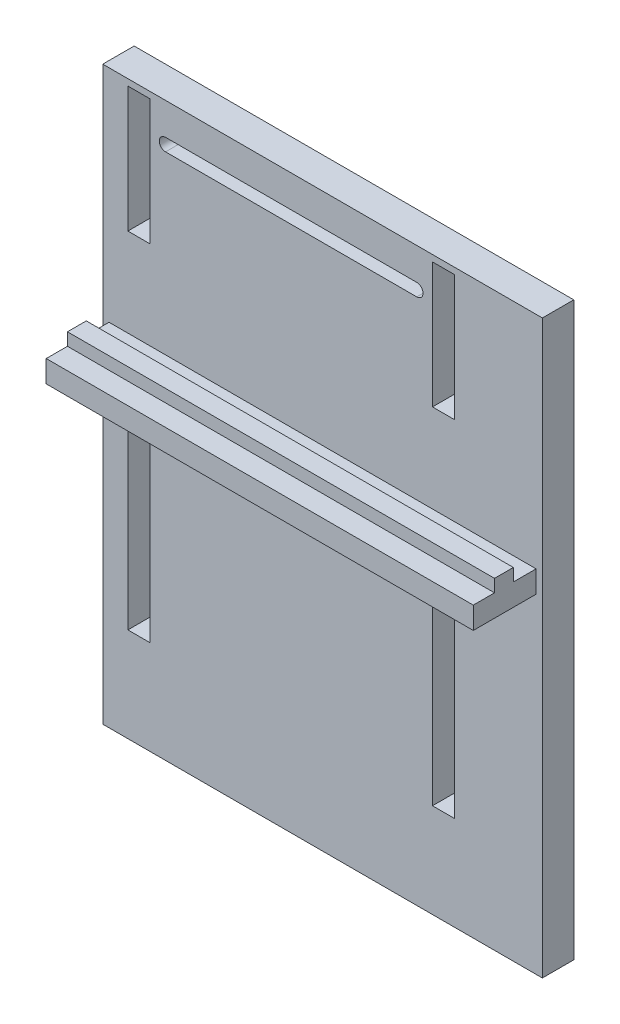
ISO-10303-21;
HEADER;
FILE_DESCRIPTION(('STEP AP214'),'2;1');
FILE_NAME('part.step','',(''),(''),'','','');
FILE_SCHEMA(('AUTOMOTIVE_DESIGN { 1 0 10303 214 1 1 1 1 }'));
ENDSEC;
DATA;
#1=APPLICATION_CONTEXT('core data for automotive mechanical design processes');
#2=APPLICATION_PROTOCOL_DEFINITION('international standard','automotive_design',2000,#1);
#3=PRODUCT_CONTEXT('',#1,'mechanical');
#4=PRODUCT('Part','Part','',(#3));
#5=PRODUCT_RELATED_PRODUCT_CATEGORY('part','',(#4));
#6=PRODUCT_DEFINITION_FORMATION('','',#4);
#7=PRODUCT_DEFINITION_CONTEXT('part definition',#1,'design');
#8=PRODUCT_DEFINITION('design','',#6,#7);
#9=PRODUCT_DEFINITION_SHAPE('','',#8);
#10=(LENGTH_UNIT() NAMED_UNIT(*) SI_UNIT(.MILLI.,.METRE.));
#11=(NAMED_UNIT(*) PLANE_ANGLE_UNIT() SI_UNIT($,.RADIAN.));
#12=(NAMED_UNIT(*) SI_UNIT($,.STERADIAN.) SOLID_ANGLE_UNIT());
#13=UNCERTAINTY_MEASURE_WITH_UNIT(LENGTH_MEASURE(1.E-05),#10,'distance_accuracy_value','');
#14=(GEOMETRIC_REPRESENTATION_CONTEXT(3) GLOBAL_UNCERTAINTY_ASSIGNED_CONTEXT((#13)) GLOBAL_UNIT_ASSIGNED_CONTEXT((#10,
#11,#12)) REPRESENTATION_CONTEXT('',''));
#15=CARTESIAN_POINT('',(0.,0.,0.));
#16=DIRECTION('',(0.,0.,1.));
#17=DIRECTION('',(1.,0.,0.));
#18=AXIS2_PLACEMENT_3D('',#15,#16,#17);
#19=CARTESIAN_POINT('',(0.,0.,5.));
#20=DIRECTION('',(0.,0.,-1.));
#21=DIRECTION('',(-1.,0.,0.));
#22=AXIS2_PLACEMENT_3D('',#19,#20,#21);
#23=PLANE('',#22);
#24=DIRECTION('',(0.,1.,0.));
#25=VECTOR('',#24,1.);
#26=CARTESIAN_POINT('',(26.,40.,5.));
#27=LINE('',#26,#25);
#28=CARTESIAN_POINT('',(26.,20.,5.));
#29=VERTEX_POINT('',#28);
#30=CARTESIAN_POINT('',(26.,40.,5.));
#31=VERTEX_POINT('',#30);
#32=EDGE_CURVE('E381',#29,#31,#27,.T.);
#33=ORIENTED_EDGE('',*,*,#32,.F.);
#34=DIRECTION('',(1.,0.,0.));
#35=VECTOR('',#34,1.);
#36=CARTESIAN_POINT('',(26.,20.,5.));
#37=LINE('',#36,#35);
#38=CARTESIAN_POINT('',(22.5,20.,5.));
#39=VERTEX_POINT('',#38);
#40=EDGE_CURVE('E389',#39,#29,#37,.T.);
#41=ORIENTED_EDGE('',*,*,#40,.F.);
#42=DIRECTION('',(0.,-1.,0.));
#43=VECTOR('',#42,1.);
#44=CARTESIAN_POINT('',(22.5,40.,5.));
#45=LINE('',#44,#43);
#46=CARTESIAN_POINT('',(22.5,40.,5.));
#47=VERTEX_POINT('',#46);
#48=EDGE_CURVE('E386',#47,#39,#45,.T.);
#49=ORIENTED_EDGE('',*,*,#48,.F.);
#50=DIRECTION('',(-1.,0.,0.));
#51=VECTOR('',#50,1.);
#52=CARTESIAN_POINT('',(26.,40.,5.));
#53=LINE('',#52,#51);
#54=EDGE_CURVE('E383',#31,#47,#53,.T.);
#55=ORIENTED_EDGE('',*,*,#54,.F.);
#56=EDGE_LOOP('',(#33,#41,#49,#55));
#57=FACE_BOUND('',#56,.T.);
#58=DIRECTION('',(0.,-1.,0.));
#59=VECTOR('',#58,1.);
#60=CARTESIAN_POINT('',(22.5,-5.,5.));
#61=LINE('',#60,#59);
#62=CARTESIAN_POINT('',(22.5,-5.,5.));
#63=VERTEX_POINT('',#62);
#64=CARTESIAN_POINT('',(22.5,-35.,5.));
#65=VERTEX_POINT('',#64);
#66=EDGE_CURVE('E443',#63,#65,#61,.T.);
#67=ORIENTED_EDGE('',*,*,#66,.F.);
#68=DIRECTION('',(-1.,0.,0.));
#69=VECTOR('',#68,1.);
#70=CARTESIAN_POINT('',(26.,-5.,5.));
#71=LINE('',#70,#69);
#72=CARTESIAN_POINT('',(26.,-5.,5.));
#73=VERTEX_POINT('',#72);
#74=EDGE_CURVE('E451',#73,#63,#71,.T.);
#75=ORIENTED_EDGE('',*,*,#74,.F.);
#76=DIRECTION('',(0.,1.,0.));
#77=VECTOR('',#76,1.);
#78=CARTESIAN_POINT('',(26.,-5.,5.));
#79=LINE('',#78,#77);
#80=CARTESIAN_POINT('',(26.,-35.,5.));
#81=VERTEX_POINT('',#80);
#82=EDGE_CURVE('E448',#81,#73,#79,.T.);
#83=ORIENTED_EDGE('',*,*,#82,.F.);
#84=DIRECTION('',(1.,0.,0.));
#85=VECTOR('',#84,1.);
#86=CARTESIAN_POINT('',(26.,-35.,5.));
#87=LINE('',#86,#85);
#88=EDGE_CURVE('E445',#65,#81,#87,.T.);
#89=ORIENTED_EDGE('',*,*,#88,.F.);
#90=EDGE_LOOP('',(#67,#75,#83,#89));
#91=FACE_BOUND('',#90,.T.);
#92=DIRECTION('',(0.,-1.,0.));
#93=VECTOR('',#92,1.);
#94=CARTESIAN_POINT('',(40.,50.,5.));
#95=LINE('',#94,#93);
#96=CARTESIAN_POINT('',(40.,41.0197048078766,5.));
#97=VERTEX_POINT('',#96);
#98=CARTESIAN_POINT('',(40.,-50.,5.));
#99=VERTEX_POINT('',#98);
#100=EDGE_CURVE('E254',#97,#99,#95,.T.);
#101=ORIENTED_EDGE('',*,*,#100,.F.);
#102=DIRECTION('',(1.,0.,0.));
#103=VECTOR('',#102,1.);
#104=CARTESIAN_POINT('',(40.,41.0197048078766,5.));
#105=LINE('',#104,#103);
#106=CARTESIAN_POINT('',(-30.,41.0197048078766,5.));
#107=VERTEX_POINT('',#106);
#108=EDGE_CURVE('E47',#107,#97,#105,.T.);
#109=ORIENTED_EDGE('',*,*,#108,.F.);
#110=DIRECTION('',(0.,-1.,0.));
#111=VECTOR('',#110,1.);
#112=CARTESIAN_POINT('',(-30.,50.,5.));
#113=LINE('',#112,#111);
#114=CARTESIAN_POINT('',(-30.,-50.,5.));
#115=VERTEX_POINT('',#114);
#116=EDGE_CURVE('E252',#107,#115,#113,.T.);
#117=ORIENTED_EDGE('',*,*,#116,.T.);
#118=DIRECTION('',(1.,0.,0.));
#119=VECTOR('',#118,1.);
#120=CARTESIAN_POINT('',(30.,-50.,5.));
#121=LINE('',#120,#119);
#122=EDGE_CURVE('E259',#115,#99,#121,.T.);
#123=ORIENTED_EDGE('',*,*,#122,.T.);
#124=EDGE_LOOP('',(#101,#109,#117,#123));
#125=FACE_BOUND('',#124,.T.);
#126=DIRECTION('',(0.,-1.,0.));
#127=VECTOR('',#126,1.);
#128=CARTESIAN_POINT('',(-26.,-5.00000000000001,5.));
#129=LINE('',#128,#127);
#130=CARTESIAN_POINT('',(-26.,-5.00000000000001,5.));
#131=VERTEX_POINT('',#130);
#132=CARTESIAN_POINT('',(-26.,-35.,5.));
#133=VERTEX_POINT('',#132);
#134=EDGE_CURVE('E412',#131,#133,#129,.T.);
#135=ORIENTED_EDGE('',*,*,#134,.F.);
#136=DIRECTION('',(-1.,0.,0.));
#137=VECTOR('',#136,1.);
#138=CARTESIAN_POINT('',(-26.,-5.00000000000001,5.));
#139=LINE('',#138,#137);
#140=CARTESIAN_POINT('',(-22.5,-5.00000000000001,5.));
#141=VERTEX_POINT('',#140);
#142=EDGE_CURVE('E420',#141,#131,#139,.T.);
#143=ORIENTED_EDGE('',*,*,#142,.F.);
#144=DIRECTION('',(0.,1.,0.));
#145=VECTOR('',#144,1.);
#146=CARTESIAN_POINT('',(-22.5,-5.00000000000001,5.));
#147=LINE('',#146,#145);
#148=CARTESIAN_POINT('',(-22.5,-35.,5.));
#149=VERTEX_POINT('',#148);
#150=EDGE_CURVE('E417',#149,#141,#147,.T.);
#151=ORIENTED_EDGE('',*,*,#150,.F.);
#152=DIRECTION('',(1.,0.,0.));
#153=VECTOR('',#152,1.);
#154=CARTESIAN_POINT('',(-26.,-35.,5.));
#155=LINE('',#154,#153);
#156=EDGE_CURVE('E414',#133,#149,#155,.T.);
#157=ORIENTED_EDGE('',*,*,#156,.F.);
#158=EDGE_LOOP('',(#135,#143,#151,#157));
#159=FACE_BOUND('',#158,.T.);
#160=DIRECTION('',(0.,-1.,0.));
#161=VECTOR('',#160,1.);
#162=CARTESIAN_POINT('',(-26.,40.,5.));
#163=LINE('',#162,#161);
#164=CARTESIAN_POINT('',(-26.,40.,5.));
#165=VERTEX_POINT('',#164);
#166=CARTESIAN_POINT('',(-26.,20.,5.));
#167=VERTEX_POINT('',#166);
#168=EDGE_CURVE('E350',#165,#167,#163,.T.);
#169=ORIENTED_EDGE('',*,*,#168,.F.);
#170=DIRECTION('',(-1.,0.,0.));
#171=VECTOR('',#170,1.);
#172=CARTESIAN_POINT('',(-26.,40.,5.));
#173=LINE('',#172,#171);
#174=CARTESIAN_POINT('',(-22.5,40.,5.));
#175=VERTEX_POINT('',#174);
#176=EDGE_CURVE('E358',#175,#165,#173,.T.);
#177=ORIENTED_EDGE('',*,*,#176,.F.);
#178=DIRECTION('',(0.,1.,0.));
#179=VECTOR('',#178,1.);
#180=CARTESIAN_POINT('',(-22.5,40.,5.));
#181=LINE('',#180,#179);
#182=CARTESIAN_POINT('',(-22.5,20.,5.));
#183=VERTEX_POINT('',#182);
#184=EDGE_CURVE('E355',#183,#175,#181,.T.);
#185=ORIENTED_EDGE('',*,*,#184,.F.);
#186=DIRECTION('',(1.,0.,0.));
#187=VECTOR('',#186,1.);
#188=CARTESIAN_POINT('',(-26.,20.,5.));
#189=LINE('',#188,#187);
#190=EDGE_CURVE('E352',#167,#183,#189,.T.);
#191=ORIENTED_EDGE('',*,*,#190,.F.);
#192=EDGE_LOOP('',(#169,#177,#185,#191));
#193=FACE_BOUND('',#192,.T.);
#194=DIRECTION('',(1.,0.,0.));
#195=VECTOR('',#194,1.);
#196=CARTESIAN_POINT('',(-20.,33.9239769318222,5.));
#197=LINE('',#196,#195);
#198=CARTESIAN_POINT('',(-20.,33.9239769318222,5.));
#199=VERTEX_POINT('',#198);
#200=CARTESIAN_POINT('',(20.,33.9239769318222,5.));
#201=VERTEX_POINT('',#200);
#202=EDGE_CURVE('E551',#199,#201,#197,.T.);
#203=ORIENTED_EDGE('',*,*,#202,.F.);
#204=CARTESIAN_POINT('',(-20.,34.9239769318222,5.));
#205=DIRECTION('',(0.,0.,1.));
#206=DIRECTION('',(1.,0.,0.));
#207=AXIS2_PLACEMENT_3D('',#204,#205,#206);
#208=CIRCLE('',#207,1.);
#209=CARTESIAN_POINT('',(-20.,35.9239769318222,5.));
#210=VERTEX_POINT('',#209);
#211=EDGE_CURVE('E55',#210,#199,#208,.T.);
#212=ORIENTED_EDGE('',*,*,#211,.F.);
#213=DIRECTION('',(-1.,0.,0.));
#214=VECTOR('',#213,1.);
#215=CARTESIAN_POINT('',(-20.,35.9239769318222,5.));
#216=LINE('',#215,#214);
#217=CARTESIAN_POINT('',(20.,35.9239769318222,5.));
#218=VERTEX_POINT('',#217);
#219=EDGE_CURVE('E290',#218,#210,#216,.T.);
#220=ORIENTED_EDGE('',*,*,#219,.F.);
#221=CARTESIAN_POINT('',(20.,34.9239769318222,5.));
#222=DIRECTION('',(0.,0.,1.));
#223=DIRECTION('',(1.,0.,0.));
#224=AXIS2_PLACEMENT_3D('',#221,#222,#223);
#225=CIRCLE('',#224,1.);
#226=EDGE_CURVE('E303',#201,#218,#225,.T.);
#227=ORIENTED_EDGE('',*,*,#226,.F.);
#228=EDGE_LOOP('',(#203,#212,#220,#227));
#229=FACE_BOUND('',#228,.T.);
#230=DIRECTION('',(0.,1.,0.));
#231=VECTOR('',#230,1.);
#232=CARTESIAN_POINT('',(39.,2.42397693182216,5.));
#233=LINE('',#232,#231);
#234=CARTESIAN_POINT('',(39.,2.42397693182216,5.));
#235=VERTEX_POINT('',#234);
#236=CARTESIAN_POINT('',(39.,5.92397693182216,5.));
#237=VERTEX_POINT('',#236);
#238=EDGE_CURVE('E560',#235,#237,#233,.T.);
#239=ORIENTED_EDGE('',*,*,#238,.F.);
#240=DIRECTION('',(1.,0.,0.));
#241=VECTOR('',#240,1.);
#242=CARTESIAN_POINT('',(29.,2.42397693182216,5.));
#243=LINE('',#242,#241);
#244=CARTESIAN_POINT('',(-29.,2.42397693182216,5.));
#245=VERTEX_POINT('',#244);
#246=EDGE_CURVE('E332',#245,#235,#243,.T.);
#247=ORIENTED_EDGE('',*,*,#246,.F.);
#248=DIRECTION('',(0.,-1.,0.));
#249=VECTOR('',#248,1.);
#250=CARTESIAN_POINT('',(-29.,5.92397693182216,5.));
#251=LINE('',#250,#249);
#252=CARTESIAN_POINT('',(-29.,5.92397693182216,5.));
#253=VERTEX_POINT('',#252);
#254=EDGE_CURVE('E339',#253,#245,#251,.T.);
#255=ORIENTED_EDGE('',*,*,#254,.F.);
#256=DIRECTION('',(-1.,0.,0.));
#257=VECTOR('',#256,1.);
#258=CARTESIAN_POINT('',(29.,5.92397693182216,5.));
#259=LINE('',#258,#257);
#260=EDGE_CURVE('E326',#237,#253,#259,.T.);
#261=ORIENTED_EDGE('',*,*,#260,.F.);
#262=EDGE_LOOP('',(#239,#247,#255,#261));
#263=FACE_BOUND('',#262,.T.);
#264=ADVANCED_FACE('F33',(#57,#91,#125,#159,#193,#229,#263),#23,.F.);
#265=CARTESIAN_POINT('',(29.,5.92397693182216,15.));
#266=DIRECTION('',(0.,-1.,0.));
#267=DIRECTION('',(1.,0.,0.));
#268=AXIS2_PLACEMENT_3D('',#265,#266,#267);
#269=PLANE('',#268);
#270=DIRECTION('',(1.,0.,0.));
#271=VECTOR('',#270,1.);
#272=CARTESIAN_POINT('',(-26.,5.92397693182216,11.6212696699472));
#273=LINE('',#272,#271);
#274=CARTESIAN_POINT('',(-29.,5.92397693182216,11.6212696699472));
#275=VERTEX_POINT('',#274);
#276=CARTESIAN_POINT('',(39.,5.92397693182216,11.6212696699472));
#277=VERTEX_POINT('',#276);
#278=EDGE_CURVE('E318',#275,#277,#273,.T.);
#279=ORIENTED_EDGE('',*,*,#278,.F.);
#280=DIRECTION('',(0.,0.,-1.));
#281=VECTOR('',#280,1.);
#282=CARTESIAN_POINT('',(-29.,5.92397693182216,15.));
#283=LINE('',#282,#281);
#284=CARTESIAN_POINT('',(-29.,5.92397693182216,15.));
#285=VERTEX_POINT('',#284);
#286=EDGE_CURVE('E346',#285,#275,#283,.T.);
#287=ORIENTED_EDGE('',*,*,#286,.F.);
#288=DIRECTION('',(-1.,0.,0.));
#289=VECTOR('',#288,1.);
#290=CARTESIAN_POINT('',(29.,5.92397693182216,15.));
#291=LINE('',#290,#289);
#292=CARTESIAN_POINT('',(39.,5.92397693182216,15.));
#293=VERTEX_POINT('',#292);
#294=EDGE_CURVE('E329',#293,#285,#291,.T.);
#295=ORIENTED_EDGE('',*,*,#294,.F.);
#296=DIRECTION('',(0.,0.,1.));
#297=VECTOR('',#296,1.);
#298=CARTESIAN_POINT('',(39.,5.92397693182216,11.6212696699472));
#299=LINE('',#298,#297);
#300=EDGE_CURVE('E536',#277,#293,#299,.T.);
#301=ORIENTED_EDGE('',*,*,#300,.F.);
#302=EDGE_LOOP('',(#279,#287,#295,#301));
#303=FACE_BOUND('',#302,.T.);
#304=ADVANCED_FACE('F499',(#303),#269,.F.);
#305=CARTESIAN_POINT('',(-29.,5.92397693182216,8.62126966994722));
#306=VERTEX_POINT('',#305);
#307=EDGE_CURVE('E345',#306,#253,#283,.T.);
#308=ORIENTED_EDGE('',*,*,#307,.F.);
#309=DIRECTION('',(-1.,0.,0.));
#310=VECTOR('',#309,1.);
#311=CARTESIAN_POINT('',(-26.,5.92397693182216,8.62126966994722));
#312=LINE('',#311,#310);
#313=CARTESIAN_POINT('',(39.,5.92397693182216,8.62126966994722));
#314=VERTEX_POINT('',#313);
#315=EDGE_CURVE('E324',#314,#306,#312,.T.);
#316=ORIENTED_EDGE('',*,*,#315,.F.);
#317=DIRECTION('',(0.,0.,1.));
#318=VECTOR('',#317,1.);
#319=CARTESIAN_POINT('',(39.,5.92397693182216,5.));
#320=LINE('',#319,#318);
#321=EDGE_CURVE('E566',#237,#314,#320,.T.);
#322=ORIENTED_EDGE('',*,*,#321,.F.);
#323=ORIENTED_EDGE('',*,*,#260,.T.);
#324=EDGE_LOOP('',(#308,#316,#322,#323));
#325=FACE_BOUND('',#324,.T.);
#326=ADVANCED_FACE('F507',(#325),#269,.F.);
#327=CARTESIAN_POINT('',(0.,0.,0.));
#328=DIRECTION('',(0.,0.,-1.));
#329=DIRECTION('',(-1.,0.,0.));
#330=AXIS2_PLACEMENT_3D('',#327,#328,#329);
#331=PLANE('',#330);
#332=DIRECTION('',(-1.,0.,0.));
#333=VECTOR('',#332,1.);
#334=CARTESIAN_POINT('',(0.,41.0197048078766,0.));
#335=LINE('',#334,#333);
#336=CARTESIAN_POINT('',(40.,41.0197048078766,0.));
#337=VERTEX_POINT('',#336);
#338=CARTESIAN_POINT('',(-30.,41.0197048078766,0.));
#339=VERTEX_POINT('',#338);
#340=EDGE_CURVE('E243',#337,#339,#335,.T.);
#341=ORIENTED_EDGE('',*,*,#340,.F.);
#342=DIRECTION('',(0.,1.,0.));
#343=VECTOR('',#342,1.);
#344=CARTESIAN_POINT('',(40.,-50.,0.));
#345=LINE('',#344,#343);
#346=CARTESIAN_POINT('',(40.,-50.,0.));
#347=VERTEX_POINT('',#346);
#348=EDGE_CURVE('E529',#347,#337,#345,.T.);
#349=ORIENTED_EDGE('',*,*,#348,.F.);
#350=DIRECTION('',(1.,0.,0.));
#351=VECTOR('',#350,1.);
#352=CARTESIAN_POINT('',(30.,-50.,0.));
#353=LINE('',#352,#351);
#354=CARTESIAN_POINT('',(-30.,-50.,0.));
#355=VERTEX_POINT('',#354);
#356=EDGE_CURVE('E260',#355,#347,#353,.T.);
#357=ORIENTED_EDGE('',*,*,#356,.F.);
#358=DIRECTION('',(0.,-1.,0.));
#359=VECTOR('',#358,1.);
#360=CARTESIAN_POINT('',(-30.,50.,0.));
#361=LINE('',#360,#359);
#362=EDGE_CURVE('E263',#339,#355,#361,.T.);
#363=ORIENTED_EDGE('',*,*,#362,.F.);
#364=EDGE_LOOP('',(#341,#349,#357,#363));
#365=FACE_BOUND('',#364,.T.);
#366=CARTESIAN_POINT('',(-20.,34.9239769318222,0.));
#367=DIRECTION('',(0.,0.,-1.));
#368=DIRECTION('',(-1.,0.,0.));
#369=AXIS2_PLACEMENT_3D('',#366,#367,#368);
#370=CIRCLE('',#369,1.);
#371=CARTESIAN_POINT('',(-20.,33.9239769318222,0.));
#372=VERTEX_POINT('',#371);
#373=CARTESIAN_POINT('',(-20.,35.9239769318222,0.));
#374=VERTEX_POINT('',#373);
#375=EDGE_CURVE('E41',#372,#374,#370,.T.);
#376=ORIENTED_EDGE('',*,*,#375,.F.);
#377=DIRECTION('',(-1.,0.,0.));
#378=VECTOR('',#377,1.);
#379=CARTESIAN_POINT('',(0.,33.9239769318222,0.));
#380=LINE('',#379,#378);
#381=CARTESIAN_POINT('',(20.,33.9239769318222,0.));
#382=VERTEX_POINT('',#381);
#383=EDGE_CURVE('E271',#382,#372,#380,.T.);
#384=ORIENTED_EDGE('',*,*,#383,.F.);
#385=CARTESIAN_POINT('',(20.,34.9239769318222,0.));
#386=DIRECTION('',(0.,0.,-1.));
#387=DIRECTION('',(-1.,0.,0.));
#388=AXIS2_PLACEMENT_3D('',#385,#386,#387);
#389=CIRCLE('',#388,1.);
#390=CARTESIAN_POINT('',(20.,35.9239769318222,0.));
#391=VERTEX_POINT('',#390);
#392=EDGE_CURVE('E273',#391,#382,#389,.T.);
#393=ORIENTED_EDGE('',*,*,#392,.F.);
#394=DIRECTION('',(1.,0.,0.));
#395=VECTOR('',#394,1.);
#396=CARTESIAN_POINT('',(0.,35.9239769318222,0.));
#397=LINE('',#396,#395);
#398=EDGE_CURVE('E276',#374,#391,#397,.T.);
#399=ORIENTED_EDGE('',*,*,#398,.F.);
#400=EDGE_LOOP('',(#376,#384,#393,#399));
#401=FACE_BOUND('',#400,.T.);
#402=CARTESIAN_POINT('',(15.,0.,0.));
#403=DIRECTION('',(0.,0.,-1.));
#404=DIRECTION('',(-1.,0.,0.));
#405=AXIS2_PLACEMENT_3D('',#402,#403,#404);
#406=CIRCLE('',#405,2.);
#407=CARTESIAN_POINT('',(13.,0.,0.));
#408=VERTEX_POINT('',#407);
#409=EDGE_CURVE('E291',#408,#408,#406,.T.);
#410=ORIENTED_EDGE('',*,*,#409,.F.);
#411=EDGE_LOOP('',(#410));
#412=FACE_BOUND('',#411,.T.);
#413=CARTESIAN_POINT('',(-15.,0.,0.));
#414=DIRECTION('',(0.,0.,-1.));
#415=DIRECTION('',(-1.,0.,0.));
#416=AXIS2_PLACEMENT_3D('',#413,#414,#415);
#417=CIRCLE('',#416,2.);
#418=CARTESIAN_POINT('',(-17.,0.,0.));
#419=VERTEX_POINT('',#418);
#420=EDGE_CURVE('E312',#419,#419,#417,.T.);
#421=ORIENTED_EDGE('',*,*,#420,.F.);
#422=EDGE_LOOP('',(#421));
#423=FACE_BOUND('',#422,.T.);
#424=DIRECTION('',(-1.,0.,0.));
#425=VECTOR('',#424,1.);
#426=CARTESIAN_POINT('',(26.,-5.,0.));
#427=LINE('',#426,#425);
#428=CARTESIAN_POINT('',(26.,-5.,0.));
#429=VERTEX_POINT('',#428);
#430=CARTESIAN_POINT('',(22.5,-5.,0.));
#431=VERTEX_POINT('',#430);
#432=EDGE_CURVE('E446',#429,#431,#427,.T.);
#433=ORIENTED_EDGE('',*,*,#432,.T.);
#434=DIRECTION('',(0.,-1.,0.));
#435=VECTOR('',#434,1.);
#436=CARTESIAN_POINT('',(22.5,-5.,0.));
#437=LINE('',#436,#435);
#438=CARTESIAN_POINT('',(22.5,-35.,0.));
#439=VERTEX_POINT('',#438);
#440=EDGE_CURVE('E442',#431,#439,#437,.T.);
#441=ORIENTED_EDGE('',*,*,#440,.T.);
#442=DIRECTION('',(1.,0.,0.));
#443=VECTOR('',#442,1.);
#444=CARTESIAN_POINT('',(26.,-35.,0.));
#445=LINE('',#444,#443);
#446=CARTESIAN_POINT('',(26.,-35.,0.));
#447=VERTEX_POINT('',#446);
#448=EDGE_CURVE('E456',#439,#447,#445,.T.);
#449=ORIENTED_EDGE('',*,*,#448,.T.);
#450=DIRECTION('',(0.,1.,0.));
#451=VECTOR('',#450,1.);
#452=CARTESIAN_POINT('',(26.,-5.,0.));
#453=LINE('',#452,#451);
#454=EDGE_CURVE('E459',#447,#429,#453,.T.);
#455=ORIENTED_EDGE('',*,*,#454,.T.);
#456=EDGE_LOOP('',(#433,#441,#449,#455));
#457=FACE_BOUND('',#456,.T.);
#458=DIRECTION('',(-1.,0.,0.));
#459=VECTOR('',#458,1.);
#460=CARTESIAN_POINT('',(-26.,-5.00000000000001,0.));
#461=LINE('',#460,#459);
#462=CARTESIAN_POINT('',(-22.5,-5.00000000000001,0.));
#463=VERTEX_POINT('',#462);
#464=CARTESIAN_POINT('',(-26.,-5.00000000000001,0.));
#465=VERTEX_POINT('',#464);
#466=EDGE_CURVE('E415',#463,#465,#461,.T.);
#467=ORIENTED_EDGE('',*,*,#466,.T.);
#468=DIRECTION('',(0.,-1.,0.));
#469=VECTOR('',#468,1.);
#470=CARTESIAN_POINT('',(-26.,-5.00000000000001,0.));
#471=LINE('',#470,#469);
#472=CARTESIAN_POINT('',(-26.,-35.,0.));
#473=VERTEX_POINT('',#472);
#474=EDGE_CURVE('E411',#465,#473,#471,.T.);
#475=ORIENTED_EDGE('',*,*,#474,.T.);
#476=DIRECTION('',(1.,0.,0.));
#477=VECTOR('',#476,1.);
#478=CARTESIAN_POINT('',(-26.,-35.,0.));
#479=LINE('',#478,#477);
#480=CARTESIAN_POINT('',(-22.5,-35.,0.));
#481=VERTEX_POINT('',#480);
#482=EDGE_CURVE('E425',#473,#481,#479,.T.);
#483=ORIENTED_EDGE('',*,*,#482,.T.);
#484=DIRECTION('',(0.,1.,0.));
#485=VECTOR('',#484,1.);
#486=CARTESIAN_POINT('',(-22.5,-5.00000000000001,0.));
#487=LINE('',#486,#485);
#488=EDGE_CURVE('E428',#481,#463,#487,.T.);
#489=ORIENTED_EDGE('',*,*,#488,.T.);
#490=EDGE_LOOP('',(#467,#475,#483,#489));
#491=FACE_BOUND('',#490,.T.);
#492=DIRECTION('',(1.,0.,0.));
#493=VECTOR('',#492,1.);
#494=CARTESIAN_POINT('',(26.,20.,0.));
#495=LINE('',#494,#493);
#496=CARTESIAN_POINT('',(22.5,20.,0.));
#497=VERTEX_POINT('',#496);
#498=CARTESIAN_POINT('',(26.,20.,0.));
#499=VERTEX_POINT('',#498);
#500=EDGE_CURVE('E384',#497,#499,#495,.T.);
#501=ORIENTED_EDGE('',*,*,#500,.T.);
#502=DIRECTION('',(0.,1.,0.));
#503=VECTOR('',#502,1.);
#504=CARTESIAN_POINT('',(26.,40.,0.));
#505=LINE('',#504,#503);
#506=CARTESIAN_POINT('',(26.,40.,0.));
#507=VERTEX_POINT('',#506);
#508=EDGE_CURVE('E380',#499,#507,#505,.T.);
#509=ORIENTED_EDGE('',*,*,#508,.T.);
#510=DIRECTION('',(-1.,0.,0.));
#511=VECTOR('',#510,1.);
#512=CARTESIAN_POINT('',(26.,40.,0.));
#513=LINE('',#512,#511);
#514=CARTESIAN_POINT('',(22.5,40.,0.));
#515=VERTEX_POINT('',#514);
#516=EDGE_CURVE('E394',#507,#515,#513,.T.);
#517=ORIENTED_EDGE('',*,*,#516,.T.);
#518=DIRECTION('',(0.,-1.,0.));
#519=VECTOR('',#518,1.);
#520=CARTESIAN_POINT('',(22.5,40.,0.));
#521=LINE('',#520,#519);
#522=EDGE_CURVE('E397',#515,#497,#521,.T.);
#523=ORIENTED_EDGE('',*,*,#522,.T.);
#524=EDGE_LOOP('',(#501,#509,#517,#523));
#525=FACE_BOUND('',#524,.T.);
#526=DIRECTION('',(-1.,0.,0.));
#527=VECTOR('',#526,1.);
#528=CARTESIAN_POINT('',(-26.,40.,0.));
#529=LINE('',#528,#527);
#530=CARTESIAN_POINT('',(-22.5,40.,0.));
#531=VERTEX_POINT('',#530);
#532=CARTESIAN_POINT('',(-26.,40.,0.));
#533=VERTEX_POINT('',#532);
#534=EDGE_CURVE('E353',#531,#533,#529,.T.);
#535=ORIENTED_EDGE('',*,*,#534,.T.);
#536=DIRECTION('',(0.,-1.,0.));
#537=VECTOR('',#536,1.);
#538=CARTESIAN_POINT('',(-26.,40.,0.));
#539=LINE('',#538,#537);
#540=CARTESIAN_POINT('',(-26.,20.,0.));
#541=VERTEX_POINT('',#540);
#542=EDGE_CURVE('E349',#533,#541,#539,.T.);
#543=ORIENTED_EDGE('',*,*,#542,.T.);
#544=DIRECTION('',(1.,0.,0.));
#545=VECTOR('',#544,1.);
#546=CARTESIAN_POINT('',(-26.,20.,0.));
#547=LINE('',#546,#545);
#548=CARTESIAN_POINT('',(-22.5,20.,0.));
#549=VERTEX_POINT('',#548);
#550=EDGE_CURVE('E363',#541,#549,#547,.T.);
#551=ORIENTED_EDGE('',*,*,#550,.T.);
#552=DIRECTION('',(0.,1.,0.));
#553=VECTOR('',#552,1.);
#554=CARTESIAN_POINT('',(-22.5,40.,0.));
#555=LINE('',#554,#553);
#556=EDGE_CURVE('E366',#549,#531,#555,.T.);
#557=ORIENTED_EDGE('',*,*,#556,.T.);
#558=EDGE_LOOP('',(#535,#543,#551,#557));
#559=FACE_BOUND('',#558,.T.);
#560=ADVANCED_FACE('F295',(#365,#401,#412,#423,#457,#491,#525,#559),#331,.T.);
#561=CARTESIAN_POINT('',(-30.,50.,5.));
#562=DIRECTION('',(1.,0.,0.));
#563=DIRECTION('',(0.,1.,0.));
#564=AXIS2_PLACEMENT_3D('',#561,#562,#563);
#565=PLANE('',#564);
#566=ORIENTED_EDGE('',*,*,#116,.F.);
#567=DIRECTION('',(0.,0.,1.));
#568=VECTOR('',#567,1.);
#569=CARTESIAN_POINT('',(-30.,41.0197048078766,-20.));
#570=LINE('',#569,#568);
#571=EDGE_CURVE('E240',#339,#107,#570,.T.);
#572=ORIENTED_EDGE('',*,*,#571,.F.);
#573=ORIENTED_EDGE('',*,*,#362,.T.);
#574=DIRECTION('',(0.,0.,-1.));
#575=VECTOR('',#574,1.);
#576=CARTESIAN_POINT('',(-30.,-50.,5.));
#577=LINE('',#576,#575);
#578=EDGE_CURVE('E258',#115,#355,#577,.T.);
#579=ORIENTED_EDGE('',*,*,#578,.F.);
#580=EDGE_LOOP('',(#566,#572,#573,#579));
#581=FACE_BOUND('',#580,.T.);
#582=ADVANCED_FACE('F35',(#581),#565,.F.);
#583=CARTESIAN_POINT('',(30.,-50.,5.));
#584=DIRECTION('',(0.,1.,0.));
#585=DIRECTION('',(-1.,0.,0.));
#586=AXIS2_PLACEMENT_3D('',#583,#584,#585);
#587=PLANE('',#586);
#588=ORIENTED_EDGE('',*,*,#356,.T.);
#589=DIRECTION('',(0.,0.,-1.));
#590=VECTOR('',#589,1.);
#591=CARTESIAN_POINT('',(40.,-50.,5.));
#592=LINE('',#591,#590);
#593=EDGE_CURVE('E527',#99,#347,#592,.T.);
#594=ORIENTED_EDGE('',*,*,#593,.F.);
#595=ORIENTED_EDGE('',*,*,#122,.F.);
#596=ORIENTED_EDGE('',*,*,#578,.T.);
#597=EDGE_LOOP('',(#588,#594,#595,#596));
#598=FACE_BOUND('',#597,.T.);
#599=ADVANCED_FACE('F514',(#598),#587,.F.);
#600=CARTESIAN_POINT('',(22.5,-5.,5.));
#601=DIRECTION('',(1.,0.,0.));
#602=DIRECTION('',(0.,1.,0.));
#603=AXIS2_PLACEMENT_3D('',#600,#601,#602);
#604=PLANE('',#603);
#605=ORIENTED_EDGE('',*,*,#440,.F.);
#606=DIRECTION('',(0.,0.,-1.));
#607=VECTOR('',#606,1.);
#608=CARTESIAN_POINT('',(22.5,-5.,5.));
#609=LINE('',#608,#607);
#610=EDGE_CURVE('E453',#63,#431,#609,.T.);
#611=ORIENTED_EDGE('',*,*,#610,.F.);
#612=ORIENTED_EDGE('',*,*,#66,.T.);
#613=DIRECTION('',(0.,0.,-1.));
#614=VECTOR('',#613,1.);
#615=CARTESIAN_POINT('',(22.5,-35.,5.));
#616=LINE('',#615,#614);
#617=EDGE_CURVE('E266',#65,#439,#616,.T.);
#618=ORIENTED_EDGE('',*,*,#617,.T.);
#619=EDGE_LOOP('',(#605,#611,#612,#618));
#620=FACE_BOUND('',#619,.T.);
#621=ADVANCED_FACE('F474',(#620),#604,.T.);
#622=CARTESIAN_POINT('',(26.,-35.,5.));
#623=DIRECTION('',(0.,1.,0.));
#624=DIRECTION('',(0.,0.,1.));
#625=AXIS2_PLACEMENT_3D('',#622,#623,#624);
#626=PLANE('',#625);
#627=ORIENTED_EDGE('',*,*,#448,.F.);
#628=ORIENTED_EDGE('',*,*,#617,.F.);
#629=ORIENTED_EDGE('',*,*,#88,.T.);
#630=DIRECTION('',(0.,0.,-1.));
#631=VECTOR('',#630,1.);
#632=CARTESIAN_POINT('',(26.,-35.,5.));
#633=LINE('',#632,#631);
#634=EDGE_CURVE('E467',#81,#447,#633,.T.);
#635=ORIENTED_EDGE('',*,*,#634,.T.);
#636=EDGE_LOOP('',(#627,#628,#629,#635));
#637=FACE_BOUND('',#636,.T.);
#638=ADVANCED_FACE('F486',(#637),#626,.T.);
#639=CARTESIAN_POINT('',(26.,-5.,5.));
#640=DIRECTION('',(-1.,0.,0.));
#641=DIRECTION('',(0.,-1.,0.));
#642=AXIS2_PLACEMENT_3D('',#639,#640,#641);
#643=PLANE('',#642);
#644=ORIENTED_EDGE('',*,*,#454,.F.);
#645=ORIENTED_EDGE('',*,*,#634,.F.);
#646=ORIENTED_EDGE('',*,*,#82,.T.);
#647=DIRECTION('',(0.,0.,-1.));
#648=VECTOR('',#647,1.);
#649=CARTESIAN_POINT('',(26.,-5.,5.));
#650=LINE('',#649,#648);
#651=EDGE_CURVE('E466',#73,#429,#650,.T.);
#652=ORIENTED_EDGE('',*,*,#651,.T.);
#653=EDGE_LOOP('',(#644,#645,#646,#652));
#654=FACE_BOUND('',#653,.T.);
#655=ADVANCED_FACE('F488',(#654),#643,.T.);
#656=CARTESIAN_POINT('',(26.,-5.,5.));
#657=DIRECTION('',(0.,-1.,0.));
#658=DIRECTION('',(0.,0.,-1.));
#659=AXIS2_PLACEMENT_3D('',#656,#657,#658);
#660=PLANE('',#659);
#661=ORIENTED_EDGE('',*,*,#432,.F.);
#662=ORIENTED_EDGE('',*,*,#651,.F.);
#663=ORIENTED_EDGE('',*,*,#74,.T.);
#664=ORIENTED_EDGE('',*,*,#610,.T.);
#665=EDGE_LOOP('',(#661,#662,#663,#664));
#666=FACE_BOUND('',#665,.T.);
#667=ADVANCED_FACE('F482',(#666),#660,.T.);
#668=CARTESIAN_POINT('',(-26.,-5.00000000000001,5.));
#669=DIRECTION('',(1.,0.,0.));
#670=DIRECTION('',(0.,1.,0.));
#671=AXIS2_PLACEMENT_3D('',#668,#669,#670);
#672=PLANE('',#671);
#673=ORIENTED_EDGE('',*,*,#474,.F.);
#674=DIRECTION('',(0.,0.,-1.));
#675=VECTOR('',#674,1.);
#676=CARTESIAN_POINT('',(-26.,-5.00000000000001,5.));
#677=LINE('',#676,#675);
#678=EDGE_CURVE('E422',#131,#465,#677,.T.);
#679=ORIENTED_EDGE('',*,*,#678,.F.);
#680=ORIENTED_EDGE('',*,*,#134,.T.);
#681=DIRECTION('',(0.,0.,-1.));
#682=VECTOR('',#681,1.);
#683=CARTESIAN_POINT('',(-26.,-35.,5.));
#684=LINE('',#683,#682);
#685=EDGE_CURVE('E439',#133,#473,#684,.T.);
#686=ORIENTED_EDGE('',*,*,#685,.T.);
#687=EDGE_LOOP('',(#673,#679,#680,#686));
#688=FACE_BOUND('',#687,.T.);
#689=ADVANCED_FACE('F495',(#688),#672,.T.);
#690=CARTESIAN_POINT('',(-26.,-35.,5.));
#691=DIRECTION('',(0.,1.,0.));
#692=DIRECTION('',(0.,0.,1.));
#693=AXIS2_PLACEMENT_3D('',#690,#691,#692);
#694=PLANE('',#693);
#695=ORIENTED_EDGE('',*,*,#482,.F.);
#696=ORIENTED_EDGE('',*,*,#685,.F.);
#697=ORIENTED_EDGE('',*,*,#156,.T.);
#698=DIRECTION('',(0.,0.,-1.));
#699=VECTOR('',#698,1.);
#700=CARTESIAN_POINT('',(-22.5,-35.,5.));
#701=LINE('',#700,#699);
#702=EDGE_CURVE('E437',#149,#481,#701,.T.);
#703=ORIENTED_EDGE('',*,*,#702,.T.);
#704=EDGE_LOOP('',(#695,#696,#697,#703));
#705=FACE_BOUND('',#704,.T.);
#706=ADVANCED_FACE('F662',(#705),#694,.T.);
#707=CARTESIAN_POINT('',(-22.5,-5.00000000000001,5.));
#708=DIRECTION('',(-1.,0.,0.));
#709=DIRECTION('',(0.,-1.,0.));
#710=AXIS2_PLACEMENT_3D('',#707,#708,#709);
#711=PLANE('',#710);
#712=ORIENTED_EDGE('',*,*,#488,.F.);
#713=ORIENTED_EDGE('',*,*,#702,.F.);
#714=ORIENTED_EDGE('',*,*,#150,.T.);
#715=DIRECTION('',(0.,0.,-1.));
#716=VECTOR('',#715,1.);
#717=CARTESIAN_POINT('',(-22.5,-5.00000000000001,5.));
#718=LINE('',#717,#716);
#719=EDGE_CURVE('E435',#141,#463,#718,.T.);
#720=ORIENTED_EDGE('',*,*,#719,.T.);
#721=EDGE_LOOP('',(#712,#713,#714,#720));
#722=FACE_BOUND('',#721,.T.);
#723=ADVANCED_FACE('F658',(#722),#711,.T.);
#724=CARTESIAN_POINT('',(-26.,-5.00000000000001,5.));
#725=DIRECTION('',(0.,-1.,0.));
#726=DIRECTION('',(1.,0.,0.));
#727=AXIS2_PLACEMENT_3D('',#724,#725,#726);
#728=PLANE('',#727);
#729=ORIENTED_EDGE('',*,*,#466,.F.);
#730=ORIENTED_EDGE('',*,*,#719,.F.);
#731=ORIENTED_EDGE('',*,*,#142,.T.);
#732=ORIENTED_EDGE('',*,*,#678,.T.);
#733=EDGE_LOOP('',(#729,#730,#731,#732));
#734=FACE_BOUND('',#733,.T.);
#735=ADVANCED_FACE('F654',(#734),#728,.T.);
#736=CARTESIAN_POINT('',(26.,40.,5.));
#737=DIRECTION('',(-1.,0.,0.));
#738=DIRECTION('',(0.,0.,1.));
#739=AXIS2_PLACEMENT_3D('',#736,#737,#738);
#740=PLANE('',#739);
#741=ORIENTED_EDGE('',*,*,#508,.F.);
#742=DIRECTION('',(0.,0.,-1.));
#743=VECTOR('',#742,1.);
#744=CARTESIAN_POINT('',(26.,20.,5.));
#745=LINE('',#744,#743);
#746=EDGE_CURVE('E391',#29,#499,#745,.T.);
#747=ORIENTED_EDGE('',*,*,#746,.F.);
#748=ORIENTED_EDGE('',*,*,#32,.T.);
#749=DIRECTION('',(0.,0.,-1.));
#750=VECTOR('',#749,1.);
#751=CARTESIAN_POINT('',(26.,40.,5.));
#752=LINE('',#751,#750);
#753=EDGE_CURVE('E408',#31,#507,#752,.T.);
#754=ORIENTED_EDGE('',*,*,#753,.T.);
#755=EDGE_LOOP('',(#741,#747,#748,#754));
#756=FACE_BOUND('',#755,.T.);
#757=ADVANCED_FACE('F650',(#756),#740,.T.);
#758=CARTESIAN_POINT('',(26.,40.,5.));
#759=DIRECTION('',(0.,-1.,0.));
#760=DIRECTION('',(1.,0.,0.));
#761=AXIS2_PLACEMENT_3D('',#758,#759,#760);
#762=PLANE('',#761);
#763=ORIENTED_EDGE('',*,*,#516,.F.);
#764=ORIENTED_EDGE('',*,*,#753,.F.);
#765=ORIENTED_EDGE('',*,*,#54,.T.);
#766=DIRECTION('',(0.,0.,-1.));
#767=VECTOR('',#766,1.);
#768=CARTESIAN_POINT('',(22.5,40.,5.));
#769=LINE('',#768,#767);
#770=EDGE_CURVE('E406',#47,#515,#769,.T.);
#771=ORIENTED_EDGE('',*,*,#770,.T.);
#772=EDGE_LOOP('',(#763,#764,#765,#771));
#773=FACE_BOUND('',#772,.T.);
#774=ADVANCED_FACE('F646',(#773),#762,.T.);
#775=CARTESIAN_POINT('',(22.5,40.,5.));
#776=DIRECTION('',(1.,0.,0.));
#777=DIRECTION('',(0.,1.,0.));
#778=AXIS2_PLACEMENT_3D('',#775,#776,#777);
#779=PLANE('',#778);
#780=ORIENTED_EDGE('',*,*,#522,.F.);
#781=ORIENTED_EDGE('',*,*,#770,.F.);
#782=ORIENTED_EDGE('',*,*,#48,.T.);
#783=DIRECTION('',(0.,0.,-1.));
#784=VECTOR('',#783,1.);
#785=CARTESIAN_POINT('',(22.5,20.,5.));
#786=LINE('',#785,#784);
#787=EDGE_CURVE('E404',#39,#497,#786,.T.);
#788=ORIENTED_EDGE('',*,*,#787,.T.);
#789=EDGE_LOOP('',(#780,#781,#782,#788));
#790=FACE_BOUND('',#789,.T.);
#791=ADVANCED_FACE('F642',(#790),#779,.T.);
#792=CARTESIAN_POINT('',(26.,20.,5.));
#793=DIRECTION('',(0.,1.,0.));
#794=DIRECTION('',(0.,0.,1.));
#795=AXIS2_PLACEMENT_3D('',#792,#793,#794);
#796=PLANE('',#795);
#797=ORIENTED_EDGE('',*,*,#500,.F.);
#798=ORIENTED_EDGE('',*,*,#787,.F.);
#799=ORIENTED_EDGE('',*,*,#40,.T.);
#800=ORIENTED_EDGE('',*,*,#746,.T.);
#801=EDGE_LOOP('',(#797,#798,#799,#800));
#802=FACE_BOUND('',#801,.T.);
#803=ADVANCED_FACE('F638',(#802),#796,.T.);
#804=CARTESIAN_POINT('',(-26.,40.,5.));
#805=DIRECTION('',(1.,0.,0.));
#806=DIRECTION('',(0.,1.,0.));
#807=AXIS2_PLACEMENT_3D('',#804,#805,#806);
#808=PLANE('',#807);
#809=ORIENTED_EDGE('',*,*,#542,.F.);
#810=DIRECTION('',(0.,0.,-1.));
#811=VECTOR('',#810,1.);
#812=CARTESIAN_POINT('',(-26.,40.,5.));
#813=LINE('',#812,#811);
#814=EDGE_CURVE('E360',#165,#533,#813,.T.);
#815=ORIENTED_EDGE('',*,*,#814,.F.);
#816=ORIENTED_EDGE('',*,*,#168,.T.);
#817=DIRECTION('',(0.,0.,-1.));
#818=VECTOR('',#817,1.);
#819=CARTESIAN_POINT('',(-26.,20.,5.));
#820=LINE('',#819,#818);
#821=EDGE_CURVE('E377',#167,#541,#820,.T.);
#822=ORIENTED_EDGE('',*,*,#821,.T.);
#823=EDGE_LOOP('',(#809,#815,#816,#822));
#824=FACE_BOUND('',#823,.T.);
#825=ADVANCED_FACE('F634',(#824),#808,.T.);
#826=CARTESIAN_POINT('',(-26.,20.,5.));
#827=DIRECTION('',(0.,1.,0.));
#828=DIRECTION('',(-1.,0.,0.));
#829=AXIS2_PLACEMENT_3D('',#826,#827,#828);
#830=PLANE('',#829);
#831=ORIENTED_EDGE('',*,*,#550,.F.);
#832=ORIENTED_EDGE('',*,*,#821,.F.);
#833=ORIENTED_EDGE('',*,*,#190,.T.);
#834=DIRECTION('',(0.,0.,-1.));
#835=VECTOR('',#834,1.);
#836=CARTESIAN_POINT('',(-22.5,20.,5.));
#837=LINE('',#836,#835);
#838=EDGE_CURVE('E375',#183,#549,#837,.T.);
#839=ORIENTED_EDGE('',*,*,#838,.T.);
#840=EDGE_LOOP('',(#831,#832,#833,#839));
#841=FACE_BOUND('',#840,.T.);
#842=ADVANCED_FACE('F630',(#841),#830,.T.);
#843=CARTESIAN_POINT('',(-22.5,40.,5.));
#844=DIRECTION('',(-1.,0.,0.));
#845=DIRECTION('',(0.,-1.,0.));
#846=AXIS2_PLACEMENT_3D('',#843,#844,#845);
#847=PLANE('',#846);
#848=ORIENTED_EDGE('',*,*,#556,.F.);
#849=ORIENTED_EDGE('',*,*,#838,.F.);
#850=ORIENTED_EDGE('',*,*,#184,.T.);
#851=DIRECTION('',(0.,0.,-1.));
#852=VECTOR('',#851,1.);
#853=CARTESIAN_POINT('',(-22.5,40.,5.));
#854=LINE('',#853,#852);
#855=EDGE_CURVE('E373',#175,#531,#854,.T.);
#856=ORIENTED_EDGE('',*,*,#855,.T.);
#857=EDGE_LOOP('',(#848,#849,#850,#856));
#858=FACE_BOUND('',#857,.T.);
#859=ADVANCED_FACE('F626',(#858),#847,.T.);
#860=CARTESIAN_POINT('',(-26.,40.,5.));
#861=DIRECTION('',(0.,-1.,0.));
#862=DIRECTION('',(1.,0.,0.));
#863=AXIS2_PLACEMENT_3D('',#860,#861,#862);
#864=PLANE('',#863);
#865=ORIENTED_EDGE('',*,*,#534,.F.);
#866=ORIENTED_EDGE('',*,*,#855,.F.);
#867=ORIENTED_EDGE('',*,*,#176,.T.);
#868=ORIENTED_EDGE('',*,*,#814,.T.);
#869=EDGE_LOOP('',(#865,#866,#867,#868));
#870=FACE_BOUND('',#869,.T.);
#871=ADVANCED_FACE('F622',(#870),#864,.T.);
#872=CARTESIAN_POINT('',(-29.,5.92397693182216,15.));
#873=DIRECTION('',(1.,0.,0.));
#874=DIRECTION('',(0.,0.,-1.));
#875=AXIS2_PLACEMENT_3D('',#872,#873,#874);
#876=PLANE('',#875);
#877=ORIENTED_EDGE('',*,*,#254,.T.);
#878=DIRECTION('',(0.,0.,-1.));
#879=VECTOR('',#878,1.);
#880=CARTESIAN_POINT('',(-29.,2.42397693182216,15.));
#881=LINE('',#880,#879);
#882=CARTESIAN_POINT('',(-29.,2.42397693182216,15.));
#883=VERTEX_POINT('',#882);
#884=EDGE_CURVE('E336',#883,#245,#881,.T.);
#885=ORIENTED_EDGE('',*,*,#884,.F.);
#886=DIRECTION('',(0.,-1.,0.));
#887=VECTOR('',#886,1.);
#888=CARTESIAN_POINT('',(-29.,5.92397693182216,15.));
#889=LINE('',#888,#887);
#890=EDGE_CURVE('E331',#285,#883,#889,.T.);
#891=ORIENTED_EDGE('',*,*,#890,.F.);
#892=ORIENTED_EDGE('',*,*,#286,.T.);
#893=DIRECTION('',(0.,-1.,0.));
#894=VECTOR('',#893,1.);
#895=CARTESIAN_POINT('',(-29.,5.92397693182216,11.6212696699472));
#896=LINE('',#895,#894);
#897=CARTESIAN_POINT('',(-29.,7.92397693182216,11.6212696699472));
#898=VERTEX_POINT('',#897);
#899=EDGE_CURVE('E542',#898,#275,#896,.T.);
#900=ORIENTED_EDGE('',*,*,#899,.F.);
#901=DIRECTION('',(0.,0.,1.));
#902=VECTOR('',#901,1.);
#903=CARTESIAN_POINT('',(-29.,7.92397693182216,11.6212696699472));
#904=LINE('',#903,#902);
#905=CARTESIAN_POINT('',(-29.,7.92397693182216,8.62126966994722));
#906=VERTEX_POINT('',#905);
#907=EDGE_CURVE('E541',#906,#898,#904,.T.);
#908=ORIENTED_EDGE('',*,*,#907,.F.);
#909=DIRECTION('',(0.,1.,0.));
#910=VECTOR('',#909,1.);
#911=CARTESIAN_POINT('',(-29.,7.92397693182216,8.62126966994722));
#912=LINE('',#911,#910);
#913=EDGE_CURVE('E545',#306,#906,#912,.T.);
#914=ORIENTED_EDGE('',*,*,#913,.F.);
#915=ORIENTED_EDGE('',*,*,#307,.T.);
#916=EDGE_LOOP('',(#877,#885,#891,#892,#900,#908,#914,#915));
#917=FACE_BOUND('',#916,.T.);
#918=ADVANCED_FACE('F596',(#917),#876,.F.);
#919=CARTESIAN_POINT('',(29.,2.42397693182216,15.));
#920=DIRECTION('',(0.,1.,0.));
#921=DIRECTION('',(-1.,0.,0.));
#922=AXIS2_PLACEMENT_3D('',#919,#920,#921);
#923=PLANE('',#922);
#924=ORIENTED_EDGE('',*,*,#246,.T.);
#925=DIRECTION('',(0.,0.,-1.));
#926=VECTOR('',#925,1.);
#927=CARTESIAN_POINT('',(39.,2.42397693182216,15.));
#928=LINE('',#927,#926);
#929=CARTESIAN_POINT('',(39.,2.42397693182216,15.));
#930=VERTEX_POINT('',#929);
#931=EDGE_CURVE('E567',#930,#235,#928,.T.);
#932=ORIENTED_EDGE('',*,*,#931,.F.);
#933=DIRECTION('',(1.,0.,0.));
#934=VECTOR('',#933,1.);
#935=CARTESIAN_POINT('',(29.,2.42397693182216,15.));
#936=LINE('',#935,#934);
#937=EDGE_CURVE('E334',#883,#930,#936,.T.);
#938=ORIENTED_EDGE('',*,*,#937,.F.);
#939=ORIENTED_EDGE('',*,*,#884,.T.);
#940=EDGE_LOOP('',(#924,#932,#938,#939));
#941=FACE_BOUND('',#940,.T.);
#942=ADVANCED_FACE('F594',(#941),#923,.F.);
#943=CARTESIAN_POINT('',(0.,0.,15.));
#944=DIRECTION('',(0.,0.,-1.));
#945=DIRECTION('',(-1.,0.,0.));
#946=AXIS2_PLACEMENT_3D('',#943,#944,#945);
#947=PLANE('',#946);
#948=ORIENTED_EDGE('',*,*,#937,.T.);
#949=DIRECTION('',(0.,-1.,0.));
#950=VECTOR('',#949,1.);
#951=CARTESIAN_POINT('',(39.,5.92397693182216,15.));
#952=LINE('',#951,#950);
#953=EDGE_CURVE('E533',#293,#930,#952,.T.);
#954=ORIENTED_EDGE('',*,*,#953,.F.);
#955=ORIENTED_EDGE('',*,*,#294,.T.);
#956=ORIENTED_EDGE('',*,*,#890,.T.);
#957=EDGE_LOOP('',(#948,#954,#955,#956));
#958=FACE_BOUND('',#957,.T.);
#959=ADVANCED_FACE('F588',(#958),#947,.F.);
#960=CARTESIAN_POINT('',(-26.,7.92397693182216,11.6212696699472));
#961=DIRECTION('',(0.,0.,-1.));
#962=DIRECTION('',(-1.,0.,0.));
#963=AXIS2_PLACEMENT_3D('',#960,#961,#962);
#964=PLANE('',#963);
#965=ORIENTED_EDGE('',*,*,#278,.T.);
#966=DIRECTION('',(0.,-1.,0.));
#967=VECTOR('',#966,1.);
#968=CARTESIAN_POINT('',(39.,7.92397693182217,11.6212696699472));
#969=LINE('',#968,#967);
#970=CARTESIAN_POINT('',(39.,7.92397693182217,11.6212696699472));
#971=VERTEX_POINT('',#970);
#972=EDGE_CURVE('E579',#971,#277,#969,.T.);
#973=ORIENTED_EDGE('',*,*,#972,.F.);
#974=DIRECTION('',(1.,0.,0.));
#975=VECTOR('',#974,1.);
#976=CARTESIAN_POINT('',(-26.,7.92397693182216,11.6212696699472));
#977=LINE('',#976,#975);
#978=EDGE_CURVE('E321',#898,#971,#977,.T.);
#979=ORIENTED_EDGE('',*,*,#978,.F.);
#980=ORIENTED_EDGE('',*,*,#899,.T.);
#981=EDGE_LOOP('',(#965,#973,#979,#980));
#982=FACE_BOUND('',#981,.T.);
#983=ADVANCED_FACE('F609',(#982),#964,.F.);
#984=CARTESIAN_POINT('',(-26.,7.92397693182216,8.62126966994722));
#985=DIRECTION('',(0.,0.,1.));
#986=DIRECTION('',(1.,0.,0.));
#987=AXIS2_PLACEMENT_3D('',#984,#985,#986);
#988=PLANE('',#987);
#989=ORIENTED_EDGE('',*,*,#315,.T.);
#990=ORIENTED_EDGE('',*,*,#913,.T.);
#991=DIRECTION('',(-1.,0.,0.));
#992=VECTOR('',#991,1.);
#993=CARTESIAN_POINT('',(-26.,7.92397693182216,8.62126966994722));
#994=LINE('',#993,#992);
#995=CARTESIAN_POINT('',(39.,7.92397693182217,8.62126966994722));
#996=VERTEX_POINT('',#995);
#997=EDGE_CURVE('E323',#996,#906,#994,.T.);
#998=ORIENTED_EDGE('',*,*,#997,.F.);
#999=DIRECTION('',(0.,1.,0.));
#1000=VECTOR('',#999,1.);
#1001=CARTESIAN_POINT('',(39.,5.92397693182216,8.62126966994722));
#1002=LINE('',#1001,#1000);
#1003=EDGE_CURVE('E569',#314,#996,#1002,.T.);
#1004=ORIENTED_EDGE('',*,*,#1003,.F.);
#1005=EDGE_LOOP('',(#989,#990,#998,#1004));
#1006=FACE_BOUND('',#1005,.T.);
#1007=ADVANCED_FACE('F603',(#1006),#988,.F.);
#1008=CARTESIAN_POINT('',(0.,7.92397693182216,0.));
#1009=DIRECTION('',(0.,1.,0.));
#1010=DIRECTION('',(-1.,0.,0.));
#1011=AXIS2_PLACEMENT_3D('',#1008,#1009,#1010);
#1012=PLANE('',#1011);
#1013=ORIENTED_EDGE('',*,*,#997,.T.);
#1014=ORIENTED_EDGE('',*,*,#907,.T.);
#1015=ORIENTED_EDGE('',*,*,#978,.T.);
#1016=DIRECTION('',(0.,0.,1.));
#1017=VECTOR('',#1016,1.);
#1018=CARTESIAN_POINT('',(39.,7.92397693182217,8.62126966994722));
#1019=LINE('',#1018,#1017);
#1020=EDGE_CURVE('E576',#996,#971,#1019,.T.);
#1021=ORIENTED_EDGE('',*,*,#1020,.F.);
#1022=EDGE_LOOP('',(#1013,#1014,#1015,#1021));
#1023=FACE_BOUND('',#1022,.T.);
#1024=ADVANCED_FACE('F606',(#1023),#1012,.T.);
#1025=CARTESIAN_POINT('',(-15.,0.,-20.));
#1026=DIRECTION('',(0.,0.,1.));
#1027=DIRECTION('',(1.,0.,0.));
#1028=AXIS2_PLACEMENT_3D('',#1025,#1026,#1027);
#1029=CYLINDRICAL_SURFACE('',#1028,2.);
#1030=CARTESIAN_POINT('',(-15.,0.,-20.));
#1031=DIRECTION('',(0.,0.,-1.));
#1032=DIRECTION('',(-1.,0.,0.));
#1033=AXIS2_PLACEMENT_3D('',#1030,#1031,#1032);
#1034=CIRCLE('',#1033,2.);
#1035=CARTESIAN_POINT('',(-17.,0.,-20.));
#1036=VERTEX_POINT('',#1035);
#1037=EDGE_CURVE('E315',#1036,#1036,#1034,.T.);
#1038=ORIENTED_EDGE('',*,*,#1037,.F.);
#1039=EDGE_LOOP('',(#1038));
#1040=FACE_BOUND('',#1039,.T.);
#1041=ORIENTED_EDGE('',*,*,#420,.T.);
#1042=EDGE_LOOP('',(#1041));
#1043=FACE_BOUND('',#1042,.T.);
#1044=ADVANCED_FACE('F755',(#1040,#1043),#1029,.T.);
#1045=CARTESIAN_POINT('',(-15.,0.,-20.));
#1046=DIRECTION('',(0.,0.,-1.));
#1047=DIRECTION('',(-1.,0.,0.));
#1048=AXIS2_PLACEMENT_3D('',#1045,#1046,#1047);
#1049=PLANE('',#1048);
#1050=ORIENTED_EDGE('',*,*,#1037,.T.);
#1051=EDGE_LOOP('',(#1050));
#1052=FACE_BOUND('',#1051,.T.);
#1053=ADVANCED_FACE('F758',(#1052),#1049,.T.);
#1054=CARTESIAN_POINT('',(15.,0.,-20.));
#1055=DIRECTION('',(0.,0.,1.));
#1056=DIRECTION('',(1.,0.,0.));
#1057=AXIS2_PLACEMENT_3D('',#1054,#1055,#1056);
#1058=CYLINDRICAL_SURFACE('',#1057,2.);
#1059=CARTESIAN_POINT('',(15.,0.,-20.));
#1060=DIRECTION('',(0.,0.,-1.));
#1061=DIRECTION('',(-1.,0.,0.));
#1062=AXIS2_PLACEMENT_3D('',#1059,#1060,#1061);
#1063=CIRCLE('',#1062,2.);
#1064=CARTESIAN_POINT('',(13.,0.,-20.));
#1065=VERTEX_POINT('',#1064);
#1066=EDGE_CURVE('E309',#1065,#1065,#1063,.T.);
#1067=ORIENTED_EDGE('',*,*,#1066,.F.);
#1068=EDGE_LOOP('',(#1067));
#1069=FACE_BOUND('',#1068,.T.);
#1070=ORIENTED_EDGE('',*,*,#409,.T.);
#1071=EDGE_LOOP('',(#1070));
#1072=FACE_BOUND('',#1071,.T.);
#1073=ADVANCED_FACE('F766',(#1069,#1072),#1058,.T.);
#1074=CARTESIAN_POINT('',(15.,0.,-20.));
#1075=DIRECTION('',(0.,0.,-1.));
#1076=DIRECTION('',(-1.,0.,0.));
#1077=AXIS2_PLACEMENT_3D('',#1074,#1075,#1076);
#1078=PLANE('',#1077);
#1079=ORIENTED_EDGE('',*,*,#1066,.T.);
#1080=EDGE_LOOP('',(#1079));
#1081=FACE_BOUND('',#1080,.T.);
#1082=ADVANCED_FACE('F774',(#1081),#1078,.T.);
#1083=CARTESIAN_POINT('',(-20.,34.9239769318222,-20.));
#1084=DIRECTION('',(0.,0.,1.));
#1085=DIRECTION('',(1.,0.,0.));
#1086=AXIS2_PLACEMENT_3D('',#1083,#1084,#1085);
#1087=CYLINDRICAL_SURFACE('',#1086,1.);
#1088=ORIENTED_EDGE('',*,*,#375,.T.);
#1089=DIRECTION('',(0.,0.,1.));
#1090=VECTOR('',#1089,1.);
#1091=CARTESIAN_POINT('',(-20.,35.9239769318222,-20.));
#1092=LINE('',#1091,#1090);
#1093=EDGE_CURVE('E280',#374,#210,#1092,.T.);
#1094=ORIENTED_EDGE('',*,*,#1093,.T.);
#1095=ORIENTED_EDGE('',*,*,#211,.T.);
#1096=DIRECTION('',(0.,0.,1.));
#1097=VECTOR('',#1096,1.);
#1098=CARTESIAN_POINT('',(-20.,33.9239769318222,-20.));
#1099=LINE('',#1098,#1097);
#1100=EDGE_CURVE('E282',#372,#199,#1099,.T.);
#1101=ORIENTED_EDGE('',*,*,#1100,.F.);
#1102=EDGE_LOOP('',(#1088,#1094,#1095,#1101));
#1103=FACE_BOUND('',#1102,.T.);
#1104=ADVANCED_FACE('F279',(#1103),#1087,.F.);
#1105=CARTESIAN_POINT('',(-20.,35.9239769318222,-20.));
#1106=DIRECTION('',(0.,1.,0.));
#1107=DIRECTION('',(-1.,0.,0.));
#1108=AXIS2_PLACEMENT_3D('',#1105,#1106,#1107);
#1109=PLANE('',#1108);
#1110=ORIENTED_EDGE('',*,*,#398,.T.);
#1111=DIRECTION('',(0.,0.,1.));
#1112=VECTOR('',#1111,1.);
#1113=CARTESIAN_POINT('',(20.,35.9239769318222,-20.));
#1114=LINE('',#1113,#1112);
#1115=EDGE_CURVE('E292',#391,#218,#1114,.T.);
#1116=ORIENTED_EDGE('',*,*,#1115,.T.);
#1117=ORIENTED_EDGE('',*,*,#219,.T.);
#1118=ORIENTED_EDGE('',*,*,#1093,.F.);
#1119=EDGE_LOOP('',(#1110,#1116,#1117,#1118));
#1120=FACE_BOUND('',#1119,.T.);
#1121=ADVANCED_FACE('F287',(#1120),#1109,.F.);
#1122=CARTESIAN_POINT('',(20.,34.9239769318222,-20.));
#1123=DIRECTION('',(0.,0.,1.));
#1124=DIRECTION('',(1.,0.,0.));
#1125=AXIS2_PLACEMENT_3D('',#1122,#1123,#1124);
#1126=CYLINDRICAL_SURFACE('',#1125,1.);
#1127=ORIENTED_EDGE('',*,*,#392,.T.);
#1128=DIRECTION('',(0.,0.,1.));
#1129=VECTOR('',#1128,1.);
#1130=CARTESIAN_POINT('',(20.,33.9239769318222,-20.));
#1131=LINE('',#1130,#1129);
#1132=EDGE_CURVE('E300',#382,#201,#1131,.T.);
#1133=ORIENTED_EDGE('',*,*,#1132,.T.);
#1134=ORIENTED_EDGE('',*,*,#226,.T.);
#1135=ORIENTED_EDGE('',*,*,#1115,.F.);
#1136=EDGE_LOOP('',(#1127,#1133,#1134,#1135));
#1137=FACE_BOUND('',#1136,.T.);
#1138=ADVANCED_FACE('F298',(#1137),#1126,.F.);
#1139=CARTESIAN_POINT('',(-20.,33.9239769318222,-20.));
#1140=DIRECTION('',(0.,-1.,0.));
#1141=DIRECTION('',(1.,0.,0.));
#1142=AXIS2_PLACEMENT_3D('',#1139,#1140,#1141);
#1143=PLANE('',#1142);
#1144=ORIENTED_EDGE('',*,*,#383,.T.);
#1145=ORIENTED_EDGE('',*,*,#1100,.T.);
#1146=ORIENTED_EDGE('',*,*,#202,.T.);
#1147=ORIENTED_EDGE('',*,*,#1132,.F.);
#1148=EDGE_LOOP('',(#1144,#1145,#1146,#1147));
#1149=FACE_BOUND('',#1148,.T.);
#1150=ADVANCED_FACE('F555',(#1149),#1143,.F.);
#1151=CARTESIAN_POINT('',(40.,0.,0.));
#1152=DIRECTION('',(1.,0.,0.));
#1153=DIRECTION('',(0.,1.,0.));
#1154=AXIS2_PLACEMENT_3D('',#1151,#1152,#1153);
#1155=PLANE('',#1154);
#1156=DIRECTION('',(0.,0.,-1.));
#1157=VECTOR('',#1156,1.);
#1158=CARTESIAN_POINT('',(40.,41.0197048078766,0.));
#1159=LINE('',#1158,#1157);
#1160=EDGE_CURVE('E11',#97,#337,#1159,.T.);
#1161=ORIENTED_EDGE('',*,*,#1160,.F.);
#1162=ORIENTED_EDGE('',*,*,#100,.T.);
#1163=ORIENTED_EDGE('',*,*,#593,.T.);
#1164=ORIENTED_EDGE('',*,*,#348,.T.);
#1165=EDGE_LOOP('',(#1161,#1162,#1163,#1164));
#1166=FACE_BOUND('',#1165,.T.);
#1167=ADVANCED_FACE('F532',(#1166),#1155,.T.);
#1168=CARTESIAN_POINT('',(39.,0.,0.));
#1169=DIRECTION('',(1.,0.,0.));
#1170=DIRECTION('',(0.,0.,-1.));
#1171=AXIS2_PLACEMENT_3D('',#1168,#1169,#1170);
#1172=PLANE('',#1171);
#1173=ORIENTED_EDGE('',*,*,#931,.T.);
#1174=ORIENTED_EDGE('',*,*,#238,.T.);
#1175=ORIENTED_EDGE('',*,*,#321,.T.);
#1176=ORIENTED_EDGE('',*,*,#1003,.T.);
#1177=ORIENTED_EDGE('',*,*,#1020,.T.);
#1178=ORIENTED_EDGE('',*,*,#972,.T.);
#1179=ORIENTED_EDGE('',*,*,#300,.T.);
#1180=ORIENTED_EDGE('',*,*,#953,.T.);
#1181=EDGE_LOOP('',(#1173,#1174,#1175,#1176,#1177,#1178,#1179,#1180));
#1182=FACE_BOUND('',#1181,.T.);
#1183=ADVANCED_FACE('F584',(#1182),#1172,.T.);
#1184=CARTESIAN_POINT('',(40.,41.0197048078766,-20.));
#1185=DIRECTION('',(0.,-1.,0.));
#1186=DIRECTION('',(0.,0.,-1.));
#1187=AXIS2_PLACEMENT_3D('',#1184,#1185,#1186);
#1188=PLANE('',#1187);
#1189=ORIENTED_EDGE('',*,*,#340,.T.);
#1190=ORIENTED_EDGE('',*,*,#571,.T.);
#1191=ORIENTED_EDGE('',*,*,#108,.T.);
#1192=ORIENTED_EDGE('',*,*,#1160,.T.);
#1193=EDGE_LOOP('',(#1189,#1190,#1191,#1192));
#1194=FACE_BOUND('',#1193,.T.);
#1195=ADVANCED_FACE('F241',(#1194),#1188,.F.);
#1196=CLOSED_SHELL('',(#264,#304,#326,#560,#582,#599,#621,#638,#655,#667,#689,#706,#723,#735,
#757,#774,#791,#803,#825,#842,#859,#871,#918,#942,#959,#983,#1007,#1024,#1044,#1053,#1073,#1082,
#1104,#1121,#1138,#1150,#1167,#1183,#1195));
#1197=MANIFOLD_SOLID_BREP('B2',#1196);
#1198=ADVANCED_BREP_SHAPE_REPRESENTATION('',(#18,#1197),#14);
#1199=SHAPE_DEFINITION_REPRESENTATION(#9,#1198);
ENDSEC;
END-ISO-10303-21;
